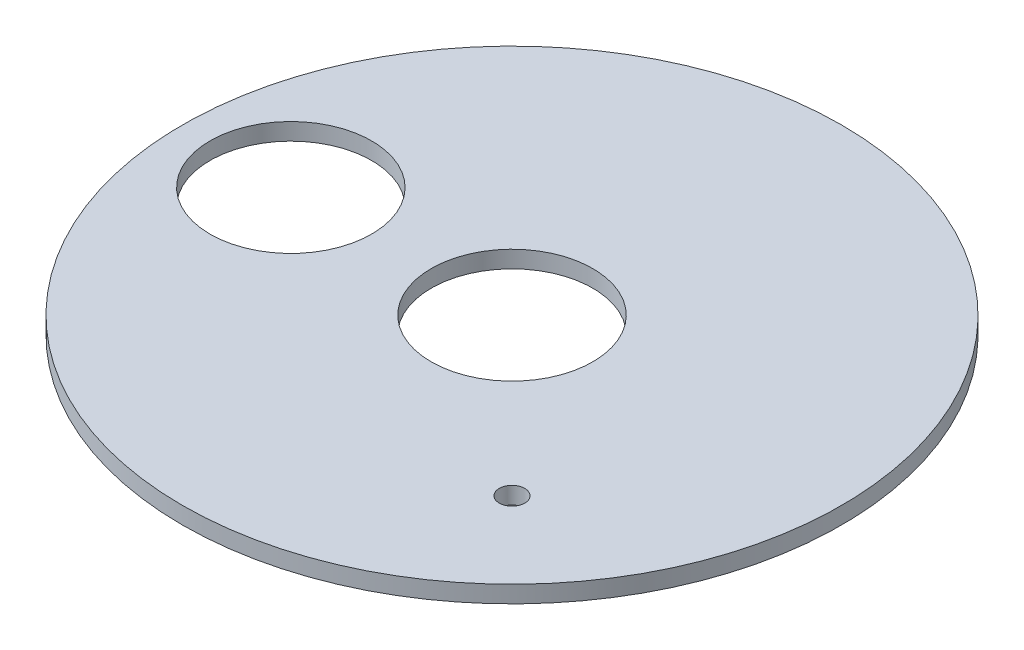
ISO-10303-21;
HEADER;
FILE_DESCRIPTION(('STEP AP214'),'2;1');
FILE_NAME('part.step','',(''),(''),'','','');
FILE_SCHEMA(('AUTOMOTIVE_DESIGN { 1 0 10303 214 1 1 1 1 }'));
ENDSEC;
DATA;
#1=APPLICATION_CONTEXT('core data for automotive mechanical design processes');
#2=APPLICATION_PROTOCOL_DEFINITION('international standard','automotive_design',2000,#1);
#3=PRODUCT_CONTEXT('',#1,'mechanical');
#4=PRODUCT('Part','Part','',(#3));
#5=PRODUCT_RELATED_PRODUCT_CATEGORY('part','',(#4));
#6=PRODUCT_DEFINITION_FORMATION('','',#4);
#7=PRODUCT_DEFINITION_CONTEXT('part definition',#1,'design');
#8=PRODUCT_DEFINITION('design','',#6,#7);
#9=PRODUCT_DEFINITION_SHAPE('','',#8);
#10=(LENGTH_UNIT() NAMED_UNIT(*) SI_UNIT(.MILLI.,.METRE.));
#11=(NAMED_UNIT(*) PLANE_ANGLE_UNIT() SI_UNIT($,.RADIAN.));
#12=(NAMED_UNIT(*) SI_UNIT($,.STERADIAN.) SOLID_ANGLE_UNIT());
#13=UNCERTAINTY_MEASURE_WITH_UNIT(LENGTH_MEASURE(1.E-05),#10,'distance_accuracy_value','');
#14=(GEOMETRIC_REPRESENTATION_CONTEXT(3) GLOBAL_UNCERTAINTY_ASSIGNED_CONTEXT((#13)) GLOBAL_UNIT_ASSIGNED_CONTEXT((#10,
#11,#12)) REPRESENTATION_CONTEXT('',''));
#15=CARTESIAN_POINT('',(0.,0.,0.));
#16=DIRECTION('',(0.,0.,1.));
#17=DIRECTION('',(1.,0.,0.));
#18=AXIS2_PLACEMENT_3D('',#15,#16,#17);
#19=CARTESIAN_POINT('',(0.,6.35,0.));
#20=DIRECTION('',(0.,-1.,0.));
#21=DIRECTION('',(0.,0.,-1.));
#22=AXIS2_PLACEMENT_3D('',#19,#20,#21);
#23=CYLINDRICAL_SURFACE('',#22,123.);
#24=CARTESIAN_POINT('',(0.,6.35,0.));
#25=DIRECTION('',(0.,1.,0.));
#26=DIRECTION('',(0.,0.,1.));
#27=AXIS2_PLACEMENT_3D('',#24,#25,#26);
#28=CIRCLE('',#27,123.);
#29=CARTESIAN_POINT('',(0.,6.35,123.));
#30=VERTEX_POINT('',#29);
#31=EDGE_CURVE('E10',#30,#30,#28,.T.);
#32=ORIENTED_EDGE('',*,*,#31,.F.);
#33=EDGE_LOOP('',(#32));
#34=FACE_BOUND('',#33,.T.);
#35=CARTESIAN_POINT('',(0.,0.,0.));
#36=DIRECTION('',(0.,1.,0.));
#37=DIRECTION('',(0.,0.,1.));
#38=AXIS2_PLACEMENT_3D('',#35,#36,#37);
#39=CIRCLE('',#38,123.);
#40=CARTESIAN_POINT('',(0.,0.,123.));
#41=VERTEX_POINT('',#40);
#42=EDGE_CURVE('E35',#41,#41,#39,.T.);
#43=ORIENTED_EDGE('',*,*,#42,.T.);
#44=EDGE_LOOP('',(#43));
#45=FACE_BOUND('',#44,.T.);
#46=ADVANCED_FACE('F32',(#34,#45),#23,.T.);
#47=CARTESIAN_POINT('',(0.,6.35,0.));
#48=DIRECTION('',(0.,1.,0.));
#49=DIRECTION('',(0.,0.,1.));
#50=AXIS2_PLACEMENT_3D('',#47,#48,#49);
#51=PLANE('',#50);
#52=CARTESIAN_POINT('',(58.3716647869492,6.35,58.3716647869498));
#53=DIRECTION('',(0.,1.,0.));
#54=DIRECTION('',(0.,0.,1.));
#55=AXIS2_PLACEMENT_3D('',#52,#53,#54);
#56=CIRCLE('',#55,4.7625);
#57=CARTESIAN_POINT('',(58.3716647869492,6.35,63.1341647869498));
#58=VERTEX_POINT('',#57);
#59=EDGE_CURVE('E62',#58,#58,#56,.T.);
#60=ORIENTED_EDGE('',*,*,#59,.F.);
#61=EDGE_LOOP('',(#60));
#62=FACE_BOUND('',#61,.T.);
#63=CARTESIAN_POINT('',(-82.55,6.35,0.));
#64=DIRECTION('',(0.,1.,0.));
#65=DIRECTION('',(0.,0.,1.));
#66=AXIS2_PLACEMENT_3D('',#63,#64,#65);
#67=CIRCLE('',#66,30.1625);
#68=CARTESIAN_POINT('',(-82.55,6.35,30.1625));
#69=VERTEX_POINT('',#68);
#70=EDGE_CURVE('E53',#69,#69,#67,.T.);
#71=ORIENTED_EDGE('',*,*,#70,.F.);
#72=EDGE_LOOP('',(#71));
#73=FACE_BOUND('',#72,.T.);
#74=CARTESIAN_POINT('',(0.,6.35,0.));
#75=DIRECTION('',(0.,1.,0.));
#76=DIRECTION('',(0.,0.,1.));
#77=AXIS2_PLACEMENT_3D('',#74,#75,#76);
#78=CIRCLE('',#77,30.1625);
#79=CARTESIAN_POINT('',(0.,6.35,30.1625));
#80=VERTEX_POINT('',#79);
#81=EDGE_CURVE('E47',#80,#80,#78,.T.);
#82=ORIENTED_EDGE('',*,*,#81,.F.);
#83=EDGE_LOOP('',(#82));
#84=FACE_BOUND('',#83,.T.);
#85=ORIENTED_EDGE('',*,*,#31,.T.);
#86=EDGE_LOOP('',(#85));
#87=FACE_BOUND('',#86,.T.);
#88=ADVANCED_FACE('F72',(#62,#73,#84,#87),#51,.T.);
#89=CARTESIAN_POINT('',(0.,0.,0.));
#90=DIRECTION('',(0.,1.,0.));
#91=DIRECTION('',(0.,0.,1.));
#92=AXIS2_PLACEMENT_3D('',#89,#90,#91);
#93=PLANE('',#92);
#94=CARTESIAN_POINT('',(58.3716647869492,0.,58.3716647869498));
#95=DIRECTION('',(0.,1.,0.));
#96=DIRECTION('',(0.,0.,1.));
#97=AXIS2_PLACEMENT_3D('',#94,#95,#96);
#98=CIRCLE('',#97,4.7625);
#99=CARTESIAN_POINT('',(58.3716647869492,0.,63.1341647869498));
#100=VERTEX_POINT('',#99);
#101=EDGE_CURVE('E56',#100,#100,#98,.F.);
#102=ORIENTED_EDGE('',*,*,#101,.F.);
#103=EDGE_LOOP('',(#102));
#104=FACE_BOUND('',#103,.T.);
#105=CARTESIAN_POINT('',(-82.55,0.,0.));
#106=DIRECTION('',(0.,1.,0.));
#107=DIRECTION('',(0.,0.,1.));
#108=AXIS2_PLACEMENT_3D('',#105,#106,#107);
#109=CIRCLE('',#108,30.1625);
#110=CARTESIAN_POINT('',(-82.55,0.,30.1625));
#111=VERTEX_POINT('',#110);
#112=EDGE_CURVE('E50',#111,#111,#109,.T.);
#113=ORIENTED_EDGE('',*,*,#112,.T.);
#114=EDGE_LOOP('',(#113));
#115=FACE_BOUND('',#114,.T.);
#116=CARTESIAN_POINT('',(0.,0.,0.));
#117=DIRECTION('',(0.,1.,0.));
#118=DIRECTION('',(0.,0.,1.));
#119=AXIS2_PLACEMENT_3D('',#116,#117,#118);
#120=CIRCLE('',#119,30.1625);
#121=CARTESIAN_POINT('',(0.,0.,30.1625));
#122=VERTEX_POINT('',#121);
#123=EDGE_CURVE('E45',#122,#122,#120,.T.);
#124=ORIENTED_EDGE('',*,*,#123,.T.);
#125=EDGE_LOOP('',(#124));
#126=FACE_BOUND('',#125,.T.);
#127=ORIENTED_EDGE('',*,*,#42,.F.);
#128=EDGE_LOOP('',(#127));
#129=FACE_BOUND('',#128,.T.);
#130=ADVANCED_FACE('F75',(#104,#115,#126,#129),#93,.F.);
#131=CARTESIAN_POINT('',(0.,0.,0.));
#132=DIRECTION('',(0.,1.,0.));
#133=DIRECTION('',(0.,0.,1.));
#134=AXIS2_PLACEMENT_3D('',#131,#132,#133);
#135=CYLINDRICAL_SURFACE('',#134,30.1625);
#136=ORIENTED_EDGE('',*,*,#123,.F.);
#137=EDGE_LOOP('',(#136));
#138=FACE_BOUND('',#137,.T.);
#139=ORIENTED_EDGE('',*,*,#81,.T.);
#140=EDGE_LOOP('',(#139));
#141=FACE_BOUND('',#140,.T.);
#142=ADVANCED_FACE('F81',(#138,#141),#135,.F.);
#143=CARTESIAN_POINT('',(-82.55,0.,0.));
#144=DIRECTION('',(0.,1.,0.));
#145=DIRECTION('',(0.,0.,1.));
#146=AXIS2_PLACEMENT_3D('',#143,#144,#145);
#147=CYLINDRICAL_SURFACE('',#146,30.1625);
#148=ORIENTED_EDGE('',*,*,#112,.F.);
#149=EDGE_LOOP('',(#148));
#150=FACE_BOUND('',#149,.T.);
#151=ORIENTED_EDGE('',*,*,#70,.T.);
#152=EDGE_LOOP('',(#151));
#153=FACE_BOUND('',#152,.T.);
#154=ADVANCED_FACE('F83',(#150,#153),#147,.F.);
#155=CARTESIAN_POINT('',(58.3716647869492,-0.00100000000000013,58.3716647869498));
#156=DIRECTION('',(0.,1.,0.));
#157=DIRECTION('',(0.,0.,1.));
#158=AXIS2_PLACEMENT_3D('',#155,#156,#157);
#159=CYLINDRICAL_SURFACE('',#158,4.7625);
#160=ORIENTED_EDGE('',*,*,#59,.T.);
#161=EDGE_LOOP('',(#160));
#162=FACE_BOUND('',#161,.T.);
#163=ORIENTED_EDGE('',*,*,#101,.T.);
#164=EDGE_LOOP('',(#163));
#165=FACE_BOUND('',#164,.T.);
#166=ADVANCED_FACE('F69',(#162,#165),#159,.F.);
#167=CLOSED_SHELL('',(#46,#88,#130,#142,#154,#166));
#168=MANIFOLD_SOLID_BREP('B2',#167);
#169=ADVANCED_BREP_SHAPE_REPRESENTATION('',(#18,#168),#14);
#170=SHAPE_DEFINITION_REPRESENTATION(#9,#169);
ENDSEC;
END-ISO-10303-21;
